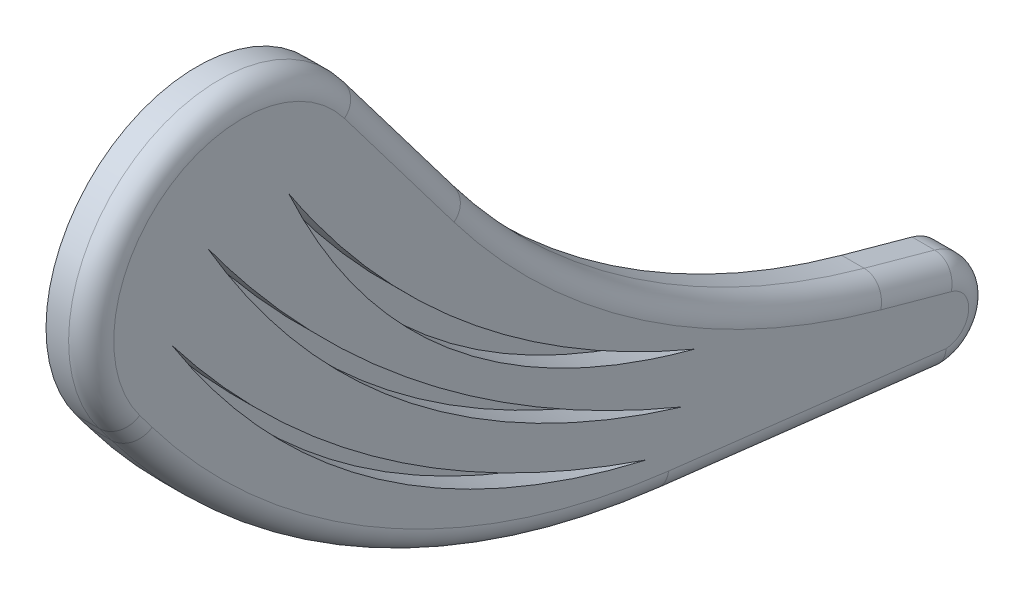
ISO-10303-21;
HEADER;
FILE_DESCRIPTION(('STEP AP214'),'2;1');
FILE_NAME('part.step','',(''),(''),'','','');
FILE_SCHEMA(('AUTOMOTIVE_DESIGN { 1 0 10303 214 1 1 1 1 }'));
ENDSEC;
DATA;
#1=APPLICATION_CONTEXT('core data for automotive mechanical design processes');
#2=APPLICATION_PROTOCOL_DEFINITION('international standard','automotive_design',2000,#1);
#3=PRODUCT_CONTEXT('',#1,'mechanical');
#4=PRODUCT('Part','Part','',(#3));
#5=PRODUCT_RELATED_PRODUCT_CATEGORY('part','',(#4));
#6=PRODUCT_DEFINITION_FORMATION('','',#4);
#7=PRODUCT_DEFINITION_CONTEXT('part definition',#1,'design');
#8=PRODUCT_DEFINITION('design','',#6,#7);
#9=PRODUCT_DEFINITION_SHAPE('','',#8);
#10=(LENGTH_UNIT() NAMED_UNIT(*) SI_UNIT(.MILLI.,.METRE.));
#11=(NAMED_UNIT(*) PLANE_ANGLE_UNIT() SI_UNIT($,.RADIAN.));
#12=(NAMED_UNIT(*) SI_UNIT($,.STERADIAN.) SOLID_ANGLE_UNIT());
#13=UNCERTAINTY_MEASURE_WITH_UNIT(LENGTH_MEASURE(1.E-05),#10,'distance_accuracy_value','');
#14=(GEOMETRIC_REPRESENTATION_CONTEXT(3) GLOBAL_UNCERTAINTY_ASSIGNED_CONTEXT((#13)) GLOBAL_UNIT_ASSIGNED_CONTEXT((#10,
#11,#12)) REPRESENTATION_CONTEXT('',''));
#15=CARTESIAN_POINT('',(0.,0.,0.));
#16=DIRECTION('',(0.,0.,1.));
#17=DIRECTION('',(1.,0.,0.));
#18=AXIS2_PLACEMENT_3D('',#15,#16,#17);
#19=CARTESIAN_POINT('',(4.064,61.3954938084868,-52.6908545838933));
#20=DIRECTION('',(-1.,0.,0.));
#21=DIRECTION('',(0.,0.,1.));
#22=AXIS2_PLACEMENT_3D('',#19,#20,#21);
#23=CYLINDRICAL_SURFACE('',#22,70.2571780129721);
#24=DIRECTION('',(-1.,0.,0.));
#25=VECTOR('',#24,1.);
#26=CARTESIAN_POINT('',(4.064,18.9694256857444,3.31003653393499));
#27=LINE('',#26,#25);
#28=CARTESIAN_POINT('',(2.032,18.9694256857444,3.31003653393499));
#29=VERTEX_POINT('',#28);
#30=CARTESIAN_POINT('',(0.,18.9694256857444,3.31003653393499));
#31=VERTEX_POINT('',#30);
#32=EDGE_CURVE('E419',#29,#31,#27,.T.);
#33=ORIENTED_EDGE('',*,*,#32,.F.);
#34=CARTESIAN_POINT('',(2.032,61.3954938084868,-52.6908545838933));
#35=DIRECTION('',(1.,0.,0.));
#36=DIRECTION('',(0.,0.,-1.));
#37=AXIS2_PLACEMENT_3D('',#34,#35,#36);
#38=CIRCLE('',#37,70.2571780129721);
#39=CARTESIAN_POINT('',(2.032,-6.33047493311499,-34.0022425338234));
#40=VERTEX_POINT('',#39);
#41=EDGE_CURVE('E11',#29,#40,#38,.T.);
#42=ORIENTED_EDGE('',*,*,#41,.T.);
#43=DIRECTION('',(-1.,0.,0.));
#44=VECTOR('',#43,1.);
#45=CARTESIAN_POINT('',(4.064,-6.33047493311499,-34.0022425338234));
#46=LINE('',#45,#44);
#47=CARTESIAN_POINT('',(0.,-6.33047493311499,-34.0022425338234));
#48=VERTEX_POINT('',#47);
#49=EDGE_CURVE('E398',#40,#48,#46,.T.);
#50=ORIENTED_EDGE('',*,*,#49,.T.);
#51=CARTESIAN_POINT('',(0.,61.3954938084868,-52.6908545838933));
#52=DIRECTION('',(1.,0.,0.));
#53=DIRECTION('',(0.,0.,-1.));
#54=AXIS2_PLACEMENT_3D('',#51,#52,#53);
#55=CIRCLE('',#54,70.2571780129721);
#56=EDGE_CURVE('E356',#31,#48,#55,.T.);
#57=ORIENTED_EDGE('',*,*,#56,.F.);
#58=EDGE_LOOP('',(#33,#42,#50,#57));
#59=FACE_BOUND('',#58,.T.);
#60=ADVANCED_FACE('F46',(#59),#23,.F.);
#61=CARTESIAN_POINT('',(4.064,5.32409536328046,-7.02761528307115));
#62=DIRECTION('',(0.,0.603868093234675,-0.797084265290137));
#63=DIRECTION('',(0.,0.797084265290137,0.603868093234675));
#64=AXIS2_PLACEMENT_3D('',#61,#62,#63);
#65=PLANE('',#64);
#66=DIRECTION('',(-1.,0.,0.));
#67=VECTOR('',#66,1.);
#68=CARTESIAN_POINT('',(4.064,31.9923804396434,13.1761789205946));
#69=LINE('',#68,#67);
#70=CARTESIAN_POINT('',(2.032,31.9923804396434,13.1761789205946));
#71=VERTEX_POINT('',#70);
#72=CARTESIAN_POINT('',(0.,31.9923804396434,13.1761789205946));
#73=VERTEX_POINT('',#72);
#74=EDGE_CURVE('E416',#71,#73,#69,.T.);
#75=ORIENTED_EDGE('',*,*,#74,.F.);
#76=DIRECTION('',(0.,-0.797084265290137,-0.603868093234675));
#77=VECTOR('',#76,1.);
#78=CARTESIAN_POINT('',(2.032,5.32409536328046,-7.02761528307115));
#79=LINE('',#78,#77);
#80=EDGE_CURVE('E56',#71,#29,#79,.T.);
#81=ORIENTED_EDGE('',*,*,#80,.T.);
#82=ORIENTED_EDGE('',*,*,#32,.T.);
#83=DIRECTION('',(0.,-0.797084265290137,-0.603868093234675));
#84=VECTOR('',#83,1.);
#85=CARTESIAN_POINT('',(0.,5.32409536328046,-7.02761528307115));
#86=LINE('',#85,#84);
#87=EDGE_CURVE('E363',#73,#31,#86,.T.);
#88=ORIENTED_EDGE('',*,*,#87,.F.);
#89=EDGE_LOOP('',(#75,#81,#82,#88));
#90=FACE_BOUND('',#89,.T.);
#91=ADVANCED_FACE('F303',(#90),#65,.T.);
#92=CARTESIAN_POINT('',(4.064,23.7918650694692,24.0005656402545));
#93=DIRECTION('',(-1.,0.,0.));
#94=DIRECTION('',(0.,0.,1.));
#95=AXIS2_PLACEMENT_3D('',#92,#93,#94);
#96=CYLINDRICAL_SURFACE('',#95,13.5799779157852);
#97=DIRECTION('',(-1.,0.,0.));
#98=VECTOR('',#97,1.);
#99=CARTESIAN_POINT('',(4.064,15.6105357122038,34.8394608856731));
#100=LINE('',#99,#98);
#101=CARTESIAN_POINT('',(2.032,15.6105357122038,34.8394608856731));
#102=VERTEX_POINT('',#101);
#103=CARTESIAN_POINT('',(0.,15.6105357122038,34.8394608856731));
#104=VERTEX_POINT('',#103);
#105=EDGE_CURVE('E413',#102,#104,#100,.T.);
#106=ORIENTED_EDGE('',*,*,#105,.F.);
#107=CARTESIAN_POINT('',(2.032,23.7918650694692,24.0005656402545));
#108=DIRECTION('',(1.,0.,0.));
#109=DIRECTION('',(0.,0.,-1.));
#110=AXIS2_PLACEMENT_3D('',#107,#108,#109);
#111=CIRCLE('',#110,13.5799779157852);
#112=EDGE_CURVE('E463',#102,#71,#111,.F.);
#113=ORIENTED_EDGE('',*,*,#112,.T.);
#114=ORIENTED_EDGE('',*,*,#74,.T.);
#115=CARTESIAN_POINT('',(0.,23.7918650694692,24.0005656402545));
#116=DIRECTION('',(1.,0.,0.));
#117=DIRECTION('',(0.,0.,-1.));
#118=AXIS2_PLACEMENT_3D('',#115,#116,#117);
#119=CIRCLE('',#118,13.5799779157852);
#120=EDGE_CURVE('E370',#73,#104,#119,.T.);
#121=ORIENTED_EDGE('',*,*,#120,.T.);
#122=EDGE_LOOP('',(#106,#113,#114,#121));
#123=FACE_BOUND('',#122,.T.);
#124=ADVANCED_FACE('F299',(#123),#96,.T.);
#125=CARTESIAN_POINT('',(4.064,-11.0867182492119,14.6880503731332));
#126=DIRECTION('',(0.,0.602455277026211,-0.798152641531224));
#127=DIRECTION('',(0.,0.798152641531224,0.602455277026211));
#128=AXIS2_PLACEMENT_3D('',#125,#126,#127);
#129=PLANE('',#128);
#130=DIRECTION('',(-1.,0.,0.));
#131=VECTOR('',#130,1.);
#132=CARTESIAN_POINT('',(4.064,14.1277592112356,33.7202432308334));
#133=LINE('',#132,#131);
#134=CARTESIAN_POINT('',(2.032,14.1277592112356,33.7202432308334));
#135=VERTEX_POINT('',#134);
#136=CARTESIAN_POINT('',(0.,14.1277592112356,33.7202432308334));
#137=VERTEX_POINT('',#136);
#138=EDGE_CURVE('E410',#135,#137,#133,.T.);
#139=ORIENTED_EDGE('',*,*,#138,.F.);
#140=DIRECTION('',(0.,-0.798152641531224,-0.602455277026211));
#141=VECTOR('',#140,1.);
#142=CARTESIAN_POINT('',(2.032,15.6105357122038,34.8394608856732));
#143=LINE('',#142,#141);
#144=EDGE_CURVE('E460',#135,#102,#143,.F.);
#145=ORIENTED_EDGE('',*,*,#144,.T.);
#146=ORIENTED_EDGE('',*,*,#105,.T.);
#147=DIRECTION('',(0.,-0.798152641531224,-0.602455277026211));
#148=VECTOR('',#147,1.);
#149=CARTESIAN_POINT('',(0.,-11.0867182492119,14.6880503731332));
#150=LINE('',#149,#148);
#151=EDGE_CURVE('E379',#104,#137,#150,.T.);
#152=ORIENTED_EDGE('',*,*,#151,.T.);
#153=EDGE_LOOP('',(#139,#145,#146,#152));
#154=FACE_BOUND('',#153,.T.);
#155=ADVANCED_FACE('F295',(#154),#129,.F.);
#156=CARTESIAN_POINT('',(4.064,56.4545668541204,-22.3557089867498));
#157=DIRECTION('',(-1.,0.,0.));
#158=DIRECTION('',(0.,0.,1.));
#159=AXIS2_PLACEMENT_3D('',#156,#157,#158);
#160=CYLINDRICAL_SURFACE('',#159,70.2571780129719);
#161=DIRECTION('',(-1.,0.,0.));
#162=VECTOR('',#161,1.);
#163=CARTESIAN_POINT('',(4.064,-13.3195793217241,-14.1313799698464));
#164=LINE('',#163,#162);
#165=CARTESIAN_POINT('',(2.032,-13.3195793217241,-14.1313799698464));
#166=VERTEX_POINT('',#165);
#167=CARTESIAN_POINT('',(0.,-13.3195793217241,-14.1313799698464));
#168=VERTEX_POINT('',#167);
#169=EDGE_CURVE('E407',#166,#168,#164,.T.);
#170=ORIENTED_EDGE('',*,*,#169,.F.);
#171=CARTESIAN_POINT('',(2.032,56.4545668541204,-22.3557089867498));
#172=DIRECTION('',(1.,0.,0.));
#173=DIRECTION('',(0.,0.,-1.));
#174=AXIS2_PLACEMENT_3D('',#171,#172,#173);
#175=CIRCLE('',#174,70.2571780129719);
#176=EDGE_CURVE('E457',#166,#135,#175,.F.);
#177=ORIENTED_EDGE('',*,*,#176,.T.);
#178=ORIENTED_EDGE('',*,*,#138,.T.);
#179=CARTESIAN_POINT('',(0.,56.4545668541204,-22.3557089867498));
#180=DIRECTION('',(1.,0.,0.));
#181=DIRECTION('',(0.,0.,-1.));
#182=AXIS2_PLACEMENT_3D('',#179,#180,#181);
#183=CIRCLE('',#182,70.2571780129719);
#184=EDGE_CURVE('E383',#168,#137,#183,.F.);
#185=ORIENTED_EDGE('',*,*,#184,.F.);
#186=EDGE_LOOP('',(#170,#177,#178,#185));
#187=FACE_BOUND('',#186,.T.);
#188=ADVANCED_FACE('F291',(#187),#160,.T.);
#189=CARTESIAN_POINT('',(4.064,-11.4942084872456,1.35483065818888));
#190=DIRECTION('',(0.,0.993124804457162,-0.117060338167646));
#191=DIRECTION('',(0.,0.117060338167646,0.993124804457162));
#192=AXIS2_PLACEMENT_3D('',#189,#190,#191);
#193=PLANE('',#192);
#194=DIRECTION('',(-1.,0.,0.));
#195=VECTOR('',#194,1.);
#196=CARTESIAN_POINT('',(4.064,-16.2786445212172,-39.2357073075474));
#197=LINE('',#196,#195);
#198=CARTESIAN_POINT('',(2.032,-16.2786445212172,-39.2357073075474));
#199=VERTEX_POINT('',#198);
#200=CARTESIAN_POINT('',(0.,-16.2786445212172,-39.2357073075474));
#201=VERTEX_POINT('',#200);
#202=EDGE_CURVE('E404',#199,#201,#197,.T.);
#203=ORIENTED_EDGE('',*,*,#202,.F.);
#204=DIRECTION('',(0.,-0.117060338167646,-0.993124804457162));
#205=VECTOR('',#204,1.);
#206=CARTESIAN_POINT('',(2.032,-13.3195793217241,-14.1313799698464));
#207=LINE('',#206,#205);
#208=EDGE_CURVE('E454',#199,#166,#207,.F.);
#209=ORIENTED_EDGE('',*,*,#208,.T.);
#210=ORIENTED_EDGE('',*,*,#169,.T.);
#211=DIRECTION('',(0.,-0.117060338167646,-0.993124804457162));
#212=VECTOR('',#211,1.);
#213=CARTESIAN_POINT('',(0.,-11.4942084872456,1.35483065818888));
#214=LINE('',#213,#212);
#215=EDGE_CURVE('E387',#168,#201,#214,.T.);
#216=ORIENTED_EDGE('',*,*,#215,.T.);
#217=EDGE_LOOP('',(#203,#209,#210,#216));
#218=FACE_BOUND('',#217,.T.);
#219=ADVANCED_FACE('F287',(#218),#193,.F.);
#220=CARTESIAN_POINT('',(4.064,-12.1046331055293,-39.2357073075474));
#221=DIRECTION('',(-1.,0.,0.));
#222=DIRECTION('',(0.,0.,1.));
#223=AXIS2_PLACEMENT_3D('',#220,#221,#222);
#224=CYLINDRICAL_SURFACE('',#223,4.17401141568788);
#225=DIRECTION('',(-1.,0.,0.));
#226=VECTOR('',#225,1.);
#227=CARTESIAN_POINT('',(4.064,-8.08100200247289,-40.346006386539));
#228=LINE('',#227,#226);
#229=CARTESIAN_POINT('',(2.032,-8.08100200247289,-40.346006386539));
#230=VERTEX_POINT('',#229);
#231=CARTESIAN_POINT('',(0.,-8.08100200247289,-40.346006386539));
#232=VERTEX_POINT('',#231);
#233=EDGE_CURVE('E401',#230,#232,#228,.T.);
#234=ORIENTED_EDGE('',*,*,#233,.F.);
#235=CARTESIAN_POINT('',(2.032,-12.1046331055293,-39.2357073075474));
#236=DIRECTION('',(1.,0.,0.));
#237=DIRECTION('',(0.,0.,-1.));
#238=AXIS2_PLACEMENT_3D('',#235,#236,#237);
#239=CIRCLE('',#238,4.17401141568788);
#240=EDGE_CURVE('E451',#230,#199,#239,.F.);
#241=ORIENTED_EDGE('',*,*,#240,.T.);
#242=ORIENTED_EDGE('',*,*,#202,.T.);
#243=CARTESIAN_POINT('',(0.,-12.1046331055293,-39.2357073075474));
#244=DIRECTION('',(1.,0.,0.));
#245=DIRECTION('',(0.,0.,-1.));
#246=AXIS2_PLACEMENT_3D('',#243,#244,#245);
#247=CIRCLE('',#246,4.17401141568788);
#248=EDGE_CURVE('E391',#201,#232,#247,.T.);
#249=ORIENTED_EDGE('',*,*,#248,.T.);
#250=EDGE_LOOP('',(#234,#241,#242,#249));
#251=FACE_BOUND('',#250,.T.);
#252=ADVANCED_FACE('F283',(#251),#224,.T.);
#253=CARTESIAN_POINT('',(4.064,2.83628832722713,-0.78265830957587));
#254=DIRECTION('',(0.,0.963972232546787,-0.266002885094809));
#255=DIRECTION('',(0.,0.266002885094809,0.963972232546788));
#256=AXIS2_PLACEMENT_3D('',#253,#254,#255);
#257=PLANE('',#256);
#258=ORIENTED_EDGE('',*,*,#49,.F.);
#259=DIRECTION('',(0.,-0.266002885094809,-0.963972232546788));
#260=VECTOR('',#259,1.);
#261=CARTESIAN_POINT('',(2.032,2.83628832722713,-0.78265830957587));
#262=LINE('',#261,#260);
#263=EDGE_CURVE('E422',#40,#230,#262,.T.);
#264=ORIENTED_EDGE('',*,*,#263,.T.);
#265=ORIENTED_EDGE('',*,*,#233,.T.);
#266=DIRECTION('',(0.,-0.266002885094809,-0.963972232546788));
#267=VECTOR('',#266,1.);
#268=CARTESIAN_POINT('',(0.,2.83628832722713,-0.78265830957587));
#269=LINE('',#268,#267);
#270=EDGE_CURVE('E395',#48,#232,#269,.T.);
#271=ORIENTED_EDGE('',*,*,#270,.F.);
#272=EDGE_LOOP('',(#258,#264,#265,#271));
#273=FACE_BOUND('',#272,.T.);
#274=ADVANCED_FACE('F276',(#273),#257,.T.);
#275=CARTESIAN_POINT('',(4.064,0.,0.));
#276=DIRECTION('',(1.,0.,0.));
#277=DIRECTION('',(0.,0.,-1.));
#278=AXIS2_PLACEMENT_3D('',#275,#276,#277);
#279=PLANE('',#278);
#280=CARTESIAN_POINT('',(4.064,-6.92361124881392,-15.6168205250554));
#281=CARTESIAN_POINT('',(4.064,3.87540107117476,10.4296008555567));
#282=CARTESIAN_POINT('',(4.064,26.808808681812,27.1165194369345));
#283=B_SPLINE_CURVE_WITH_KNOTS('',2,(#280,#281,#282),.UNSPECIFIED.,.F.,.F.,(3,3),(0.,1.),.UNSPECIFIED.);
#284=CARTESIAN_POINT('',(4.064,-6.92361124881392,-15.6168205250554));
#285=VERTEX_POINT('',#284);
#286=CARTESIAN_POINT('',(4.064,26.808808681812,27.1165194369345));
#287=VERTEX_POINT('',#286);
#288=EDGE_CURVE('E64',#285,#287,#283,.T.);
#289=ORIENTED_EDGE('',*,*,#288,.F.);
#290=CARTESIAN_POINT('',(4.064,26.808808681812,27.1165194369345));
#291=CARTESIAN_POINT('',(4.064,1.59519261586339,12.366986247784));
#292=CARTESIAN_POINT('',(4.064,-6.92361124881392,-15.6168205250554));
#293=B_SPLINE_CURVE_WITH_KNOTS('',2,(#290,#291,#292),.UNSPECIFIED.,.F.,.F.,(3,3),(0.,1.),.UNSPECIFIED.);
#294=EDGE_CURVE('E239',#287,#285,#293,.T.);
#295=ORIENTED_EDGE('',*,*,#294,.F.);
#296=EDGE_LOOP('',(#289,#295));
#297=FACE_BOUND('',#296,.T.);
#298=CARTESIAN_POINT('',(4.064,27.3976539175087,19.7980143647039));
#299=CARTESIAN_POINT('',(4.064,3.87492946570004,8.98445813811228));
#300=CARTESIAN_POINT('',(4.064,-2.96993609485029,-16.7103902484922));
#301=B_SPLINE_CURVE_WITH_KNOTS('',2,(#298,#299,#300),.UNSPECIFIED.,.F.,.F.,(3,3),(0.,1.),.UNSPECIFIED.);
#302=CARTESIAN_POINT('',(4.064,27.3976539175087,19.7980143647039));
#303=VERTEX_POINT('',#302);
#304=CARTESIAN_POINT('',(4.064,-2.96993609485029,-16.7103902484922));
#305=VERTEX_POINT('',#304);
#306=EDGE_CURVE('E72',#303,#305,#301,.T.);
#307=ORIENTED_EDGE('',*,*,#306,.F.);
#308=CARTESIAN_POINT('',(4.064,-2.96993609485029,-16.7103902484922));
#309=CARTESIAN_POINT('',(4.064,6.66431164897271,6.19544167854816));
#310=CARTESIAN_POINT('',(4.064,27.3976539175087,19.7980143647039));
#311=B_SPLINE_CURVE_WITH_KNOTS('',2,(#308,#309,#310),.UNSPECIFIED.,.F.,.F.,(3,3),(0.,1.),.UNSPECIFIED.);
#312=EDGE_CURVE('E183',#305,#303,#311,.T.);
#313=ORIENTED_EDGE('',*,*,#312,.F.);
#314=EDGE_LOOP('',(#307,#313));
#315=FACE_BOUND('',#314,.T.);
#316=CARTESIAN_POINT('',(4.064,-9.44723368751411,-12.4202321027019));
#317=CARTESIAN_POINT('',(4.064,-0.495600494692885,13.9411575609503));
#318=CARTESIAN_POINT('',(4.064,20.8362355768882,30.313107859288));
#319=B_SPLINE_CURVE_WITH_KNOTS('',2,(#316,#317,#318),.UNSPECIFIED.,.F.,.F.,(3,3),(0.,1.),.UNSPECIFIED.);
#320=CARTESIAN_POINT('',(4.064,-9.44723368751411,-12.4202321027019));
#321=VERTEX_POINT('',#320);
#322=CARTESIAN_POINT('',(4.064,20.8362355768882,30.313107859288));
#323=VERTEX_POINT('',#322);
#324=EDGE_CURVE('E484',#321,#323,#319,.T.);
#325=ORIENTED_EDGE('',*,*,#324,.F.);
#326=CARTESIAN_POINT('',(4.064,20.8362355768882,30.313107859288));
#327=CARTESIAN_POINT('',(4.064,-3.07472840093882,15.0725793982242));
#328=CARTESIAN_POINT('',(4.064,-9.44723368751411,-12.4202321027019));
#329=B_SPLINE_CURVE_WITH_KNOTS('',2,(#326,#327,#328),.UNSPECIFIED.,.F.,.F.,(3,3),(0.,1.),.UNSPECIFIED.);
#330=EDGE_CURVE('E256',#323,#321,#329,.T.);
#331=ORIENTED_EDGE('',*,*,#330,.F.);
#332=EDGE_LOOP('',(#325,#331));
#333=FACE_BOUND('',#332,.T.);
#334=CARTESIAN_POINT('',(4.064,-12.1046331055293,-39.2357073075474));
#335=DIRECTION('',(1.,0.,0.));
#336=DIRECTION('',(0.,0.,-1.));
#337=AXIS2_PLACEMENT_3D('',#334,#335,#336);
#338=CIRCLE('',#337,2.14201141568788);
#339=CARTESIAN_POINT('',(4.064,-14.2443247289105,-39.3353700476752));
#340=VERTEX_POINT('',#339);
#341=CARTESIAN_POINT('',(4.064,-10.039793579008,-39.8054885240264));
#342=VERTEX_POINT('',#341);
#343=EDGE_CURVE('E444',#340,#342,#338,.T.);
#344=ORIENTED_EDGE('',*,*,#343,.T.);
#345=DIRECTION('',(0.,-0.266002885094809,-0.963972232546788));
#346=VECTOR('',#345,1.);
#347=CARTESIAN_POINT('',(4.064,0.877496750692055,-0.242140447063218));
#348=LINE('',#347,#346);
#349=CARTESIAN_POINT('',(4.064,-8.28926650965007,-33.4617246713108));
#350=VERTEX_POINT('',#349);
#351=EDGE_CURVE('E447',#342,#350,#348,.F.);
#352=ORIENTED_EDGE('',*,*,#351,.T.);
#353=CARTESIAN_POINT('',(4.064,61.3954938084868,-52.6908545838933));
#354=DIRECTION('',(1.,0.,0.));
#355=DIRECTION('',(0.,0.,-1.));
#356=AXIS2_PLACEMENT_3D('',#353,#354,#355);
#357=CIRCLE('',#356,72.2891780129721);
#358=CARTESIAN_POINT('',(4.064,17.7423657202915,4.92971176100454));
#359=VERTEX_POINT('',#358);
#360=EDGE_CURVE('E426',#350,#359,#357,.F.);
#361=ORIENTED_EDGE('',*,*,#360,.T.);
#362=DIRECTION('',(0.,-0.797084265290137,-0.603868093234675));
#363=VECTOR('',#362,1.);
#364=CARTESIAN_POINT('',(4.064,4.0970353978276,-5.40794005600159));
#365=LINE('',#364,#363);
#366=CARTESIAN_POINT('',(4.064,30.7653204741906,14.7958541476642));
#367=VERTEX_POINT('',#366);
#368=EDGE_CURVE('E429',#359,#367,#365,.F.);
#369=ORIENTED_EDGE('',*,*,#368,.T.);
#370=CARTESIAN_POINT('',(4.064,23.7918650694692,24.0005656402545));
#371=DIRECTION('',(1.,0.,0.));
#372=DIRECTION('',(0.,0.,-1.));
#373=AXIS2_PLACEMENT_3D('',#370,#371,#372);
#374=CIRCLE('',#373,11.5479779157852);
#375=CARTESIAN_POINT('',(4.064,16.834724835121,33.2176147180817));
#376=VERTEX_POINT('',#375);
#377=EDGE_CURVE('E432',#367,#376,#374,.T.);
#378=ORIENTED_EDGE('',*,*,#377,.T.);
#379=DIRECTION('',(0.,-0.798152641531224,-0.602455277026211));
#380=VECTOR('',#379,1.);
#381=CARTESIAN_POINT('',(4.064,15.3519483341529,32.098397063242));
#382=LINE('',#381,#380);
#383=CARTESIAN_POINT('',(4.064,15.3519483341529,32.0983970632419));
#384=VERTEX_POINT('',#383);
#385=EDGE_CURVE('E435',#376,#384,#382,.T.);
#386=ORIENTED_EDGE('',*,*,#385,.T.);
#387=CARTESIAN_POINT('',(4.064,56.4545668541204,-22.3557089867498));
#388=DIRECTION('',(1.,0.,0.));
#389=DIRECTION('',(0.,0.,-1.));
#390=AXIS2_PLACEMENT_3D('',#387,#388,#389);
#391=CIRCLE('',#390,68.2251780129719);
#392=CARTESIAN_POINT('',(4.064,-11.3015497190673,-14.3692465770031));
#393=VERTEX_POINT('',#392);
#394=EDGE_CURVE('E438',#384,#393,#391,.T.);
#395=ORIENTED_EDGE('',*,*,#394,.T.);
#396=DIRECTION('',(0.,-0.117060338167646,-0.993124804457162));
#397=VECTOR('',#396,1.);
#398=CARTESIAN_POINT('',(4.064,-14.2606149185602,-39.4735739147041));
#399=LINE('',#398,#397);
#400=EDGE_CURVE('E441',#393,#340,#399,.T.);
#401=ORIENTED_EDGE('',*,*,#400,.T.);
#402=EDGE_LOOP('',(#344,#352,#361,#369,#378,#386,#395,#401));
#403=FACE_BOUND('',#402,.T.);
#404=ADVANCED_FACE('F188',(#297,#315,#333,#403),#279,.T.);
#405=CARTESIAN_POINT('',(0.,0.,0.));
#406=DIRECTION('',(1.,0.,0.));
#407=DIRECTION('',(0.,0.,-1.));
#408=AXIS2_PLACEMENT_3D('',#405,#406,#407);
#409=PLANE('',#408);
#410=ORIENTED_EDGE('',*,*,#56,.T.);
#411=ORIENTED_EDGE('',*,*,#270,.T.);
#412=ORIENTED_EDGE('',*,*,#248,.F.);
#413=ORIENTED_EDGE('',*,*,#215,.F.);
#414=ORIENTED_EDGE('',*,*,#184,.T.);
#415=ORIENTED_EDGE('',*,*,#151,.F.);
#416=ORIENTED_EDGE('',*,*,#120,.F.);
#417=ORIENTED_EDGE('',*,*,#87,.T.);
#418=EDGE_LOOP('',(#410,#411,#412,#413,#414,#415,#416,#417));
#419=FACE_BOUND('',#418,.T.);
#420=ADVANCED_FACE('F275',(#419),#409,.F.);
#421=CARTESIAN_POINT('',(2.032,-9.86252912629467,13.0662042055418));
#422=DIRECTION('',(0.,0.798152641531224,0.602455277026211));
#423=DIRECTION('',(0.,-0.602455277026211,0.798152641531224));
#424=AXIS2_PLACEMENT_3D('',#421,#422,#423);
#425=CYLINDRICAL_SURFACE('',#424,2.032);
#426=CARTESIAN_POINT('',(2.032,15.3519483341529,32.0983970632419));
#427=DIRECTION('',(0.,-0.798152641531225,-0.60245527702621));
#428=DIRECTION('',(0.,0.60245527702621,-0.798152641531225));
#429=AXIS2_PLACEMENT_3D('',#426,#427,#428);
#430=CIRCLE('',#429,2.032);
#431=EDGE_CURVE('E347',#384,#135,#430,.T.);
#432=ORIENTED_EDGE('',*,*,#431,.F.);
#433=ORIENTED_EDGE('',*,*,#385,.F.);
#434=CARTESIAN_POINT('',(2.032,16.834724835121,33.2176147180817));
#435=DIRECTION('',(0.,0.798152641531224,0.602455277026212));
#436=DIRECTION('',(0.,-0.602455277026212,0.798152641531224));
#437=AXIS2_PLACEMENT_3D('',#434,#435,#436);
#438=CIRCLE('',#437,2.032);
#439=EDGE_CURVE('E50',#102,#376,#438,.T.);
#440=ORIENTED_EDGE('',*,*,#439,.F.);
#441=ORIENTED_EDGE('',*,*,#144,.F.);
#442=EDGE_LOOP('',(#432,#433,#440,#441));
#443=FACE_BOUND('',#442,.T.);
#444=ADVANCED_FACE('F48',(#443),#425,.T.);
#445=CARTESIAN_POINT('',(2.032,23.7918650694692,24.0005656402545));
#446=DIRECTION('',(1.,0.,0.));
#447=DIRECTION('',(0.,0.,-1.));
#448=AXIS2_PLACEMENT_3D('',#445,#446,#447);
#449=TOROIDAL_SURFACE('',#448,11.5479779157852,2.032);
#450=ORIENTED_EDGE('',*,*,#439,.T.);
#451=ORIENTED_EDGE('',*,*,#377,.F.);
#452=CARTESIAN_POINT('',(2.032,30.7653204741906,14.7958541476642));
#453=DIRECTION('',(0.,-0.797084265290135,-0.603868093234677));
#454=DIRECTION('',(0.,0.603868093234677,-0.797084265290135));
#455=AXIS2_PLACEMENT_3D('',#452,#453,#454);
#456=CIRCLE('',#455,2.032);
#457=EDGE_CURVE('E344',#71,#367,#456,.T.);
#458=ORIENTED_EDGE('',*,*,#457,.F.);
#459=ORIENTED_EDGE('',*,*,#112,.F.);
#460=EDGE_LOOP('',(#450,#451,#458,#459));
#461=FACE_BOUND('',#460,.T.);
#462=ADVANCED_FACE('F565',(#461),#449,.T.);
#463=CARTESIAN_POINT('',(2.032,56.4545668541204,-22.3557089867498));
#464=DIRECTION('',(1.,0.,0.));
#465=DIRECTION('',(0.,0.,-1.));
#466=AXIS2_PLACEMENT_3D('',#463,#464,#465);
#467=TOROIDAL_SURFACE('',#466,68.2251780129719,2.032);
#468=ORIENTED_EDGE('',*,*,#431,.T.);
#469=ORIENTED_EDGE('',*,*,#176,.F.);
#470=CARTESIAN_POINT('',(2.032,-11.3015497190673,-14.3692465770031));
#471=DIRECTION('',(0.,-0.117060338167646,-0.993124804457162));
#472=DIRECTION('',(0.,0.993124804457162,-0.117060338167646));
#473=AXIS2_PLACEMENT_3D('',#470,#471,#472);
#474=CIRCLE('',#473,2.032);
#475=EDGE_CURVE('E340',#393,#166,#474,.T.);
#476=ORIENTED_EDGE('',*,*,#475,.F.);
#477=ORIENTED_EDGE('',*,*,#394,.F.);
#478=EDGE_LOOP('',(#468,#469,#476,#477));
#479=FACE_BOUND('',#478,.T.);
#480=ADVANCED_FACE('F569',(#479),#467,.T.);
#481=CARTESIAN_POINT('',(2.032,4.0970353978276,-5.40794005600159));
#482=DIRECTION('',(0.,-0.797084265290137,-0.603868093234675));
#483=DIRECTION('',(0.,0.603868093234675,-0.797084265290137));
#484=AXIS2_PLACEMENT_3D('',#481,#482,#483);
#485=CYLINDRICAL_SURFACE('',#484,2.032);
#486=ORIENTED_EDGE('',*,*,#457,.T.);
#487=ORIENTED_EDGE('',*,*,#368,.F.);
#488=CARTESIAN_POINT('',(2.032,17.7423657202915,4.92971176100455));
#489=DIRECTION('',(0.,-0.797084265290137,-0.603868093234675));
#490=DIRECTION('',(0.,0.603868093234675,-0.797084265290137));
#491=AXIS2_PLACEMENT_3D('',#488,#489,#490);
#492=CIRCLE('',#491,2.032);
#493=EDGE_CURVE('E334',#29,#359,#492,.T.);
#494=ORIENTED_EDGE('',*,*,#493,.F.);
#495=ORIENTED_EDGE('',*,*,#80,.F.);
#496=EDGE_LOOP('',(#486,#487,#494,#495));
#497=FACE_BOUND('',#496,.T.);
#498=ADVANCED_FACE('F320',(#497),#485,.T.);
#499=CARTESIAN_POINT('',(2.032,-9.47617888458869,1.11696405103223));
#500=DIRECTION('',(0.,0.117060338167646,0.993124804457162));
#501=DIRECTION('',(0.,-0.993124804457162,0.117060338167646));
#502=AXIS2_PLACEMENT_3D('',#499,#500,#501);
#503=CYLINDRICAL_SURFACE('',#502,2.032);
#504=ORIENTED_EDGE('',*,*,#475,.T.);
#505=ORIENTED_EDGE('',*,*,#208,.F.);
#506=CARTESIAN_POINT('',(2.032,-16.2786445212172,-39.2357073075474));
#507=CARTESIAN_POINT('',(2.08909086477576,-16.2786441679613,-39.2357071301812));
#508=CARTESIAN_POINT('',(2.14615435802799,-16.2762369801685,-39.2358487301557));
#509=CARTESIAN_POINT('',(2.25987260834942,-16.2666339179411,-39.2364123251686));
#510=CARTESIAN_POINT('',(2.31652738591422,-16.2594382853407,-39.2368343060466));
#511=CARTESIAN_POINT('',(2.48517360158773,-16.2307369301694,-39.2385142820201));
#512=CARTESIAN_POINT('',(2.59603461393692,-16.2021165624859,-39.2401863318162));
#513=CARTESIAN_POINT('',(2.81136493946595,-16.126702402133,-39.244553398101));
#514=CARTESIAN_POINT('',(2.91583127055291,-16.0799002041785,-39.247248887703));
#515=CARTESIAN_POINT('',(3.11540925704555,-15.9694638762637,-39.2535275307053));
#516=CARTESIAN_POINT('',(3.21052298054895,-15.9058334789771,-39.2571104872448));
#517=CARTESIAN_POINT('',(3.38876817069997,-15.7635067678171,-39.2649845993989));
#518=CARTESIAN_POINT('',(3.47189261140737,-15.6848016822782,-39.2692761671388));
#519=CARTESIAN_POINT('',(3.62378190293188,-15.5145541278173,-39.2783442101934));
#520=CARTESIAN_POINT('',(3.69254218598409,-15.4230075907686,-39.2831208390408));
#521=CARTESIAN_POINT('',(3.81385153787197,-15.2295297924234,-39.2929091332432));
#522=CARTESIAN_POINT('',(3.86637068258056,-15.1275798169764,-39.2979212130798));
#523=CARTESIAN_POINT('',(3.95353327565749,-14.9163476607062,-39.3078877802877));
#524=CARTESIAN_POINT('',(3.98819062340749,-14.8070712561002,-39.3128423094989));
#525=CARTESIAN_POINT('',(4.02952475155169,-14.6249427675017,-39.3206540296102));
#526=CARTESIAN_POINT('',(4.04179431938676,-14.5533081107696,-39.3236182945804));
#527=CARTESIAN_POINT('',(4.05862277099298,-14.4092030069076,-39.329324499834));
#528=CARTESIAN_POINT('',(4.06319413496736,-14.3367341046935,-39.3320667930889));
#529=CARTESIAN_POINT('',(4.06396760399971,-14.2576256415239,-39.33489783133));
#530=CARTESIAN_POINT('',(4.06400008522782,-14.2509749499781,-39.3351345840586));
#531=CARTESIAN_POINT('',(4.064,-14.2443247289104,-39.335370047675));
#532=B_SPLINE_CURVE_WITH_KNOTS('',3,(#506,#507,#508,#509,#510,#511,#512,#513,#514,#515,#516,
#517,#518,#519,#520,#521,#522,#523,#524,#525,#526,#527,#528,#529,#530,#531),.UNSPECIFIED.,.F.,
.F.,(4,2,2,2,2,2,2,2,2,2,2,2,4),(0.,0.171167327728765,0.34232601153386,0.684087476598604,
1.02600712307114,1.36785099164416,1.7098943800982,2.052046372446,2.39482507101977,
2.73733662776694,2.95519626989931,3.17270238028774,3.19266695379809),.UNSPECIFIED.);
#533=EDGE_CURVE('E325',#340,#199,#532,.F.);
#534=ORIENTED_EDGE('',*,*,#533,.F.);
#535=ORIENTED_EDGE('',*,*,#400,.F.);
#536=EDGE_LOOP('',(#504,#505,#534,#535));
#537=FACE_BOUND('',#536,.T.);
#538=ADVANCED_FACE('F315',(#537),#503,.T.);
#539=CARTESIAN_POINT('',(2.032,61.3954938084868,-52.6908545838933));
#540=DIRECTION('',(1.,0.,0.));
#541=DIRECTION('',(0.,0.,-1.));
#542=AXIS2_PLACEMENT_3D('',#539,#540,#541);
#543=TOROIDAL_SURFACE('',#542,72.2891780129721,2.032);
#544=ORIENTED_EDGE('',*,*,#493,.T.);
#545=ORIENTED_EDGE('',*,*,#360,.F.);
#546=CARTESIAN_POINT('',(2.032,-8.28926650965007,-33.4617246713108));
#547=DIRECTION('',(0.,-0.266002885094806,-0.963972232546788));
#548=DIRECTION('',(0.,0.963972232546788,-0.266002885094806));
#549=AXIS2_PLACEMENT_3D('',#546,#547,#548);
#550=CIRCLE('',#549,2.032);
#551=EDGE_CURVE('E335',#40,#350,#550,.T.);
#552=ORIENTED_EDGE('',*,*,#551,.F.);
#553=ORIENTED_EDGE('',*,*,#41,.F.);
#554=EDGE_LOOP('',(#544,#545,#552,#553));
#555=FACE_BOUND('',#554,.T.);
#556=ADVANCED_FACE('F319',(#555),#543,.T.);
#557=CARTESIAN_POINT('',(2.032,-12.1046331055293,-39.2357073075474));
#558=DIRECTION('',(1.,0.,0.));
#559=DIRECTION('',(0.,0.,-1.));
#560=AXIS2_PLACEMENT_3D('',#557,#558,#559);
#561=TOROIDAL_SURFACE('',#560,2.14201141568788,2.032);
#562=ORIENTED_EDGE('',*,*,#533,.T.);
#563=ORIENTED_EDGE('',*,*,#240,.F.);
#564=CARTESIAN_POINT('',(2.032,-10.039793579008,-39.8054885240264));
#565=DIRECTION('',(0.,0.266002885094809,0.963972232546788));
#566=DIRECTION('',(0.,-0.963972232546788,0.266002885094809));
#567=AXIS2_PLACEMENT_3D('',#564,#565,#566);
#568=CIRCLE('',#567,2.032);
#569=EDGE_CURVE('E467',#342,#230,#568,.T.);
#570=ORIENTED_EDGE('',*,*,#569,.F.);
#571=ORIENTED_EDGE('',*,*,#343,.F.);
#572=EDGE_LOOP('',(#562,#563,#570,#571));
#573=FACE_BOUND('',#572,.T.);
#574=ADVANCED_FACE('F313',(#573),#561,.T.);
#575=CARTESIAN_POINT('',(2.032,0.877496750692056,-0.242140447063218));
#576=DIRECTION('',(0.,-0.266002885094809,-0.963972232546788));
#577=DIRECTION('',(0.,0.963972232546787,-0.266002885094809));
#578=AXIS2_PLACEMENT_3D('',#575,#576,#577);
#579=CYLINDRICAL_SURFACE('',#578,2.032);
#580=ORIENTED_EDGE('',*,*,#551,.T.);
#581=ORIENTED_EDGE('',*,*,#351,.F.);
#582=ORIENTED_EDGE('',*,*,#569,.T.);
#583=ORIENTED_EDGE('',*,*,#263,.F.);
#584=EDGE_LOOP('',(#580,#581,#582,#583));
#585=FACE_BOUND('',#584,.T.);
#586=ADVANCED_FACE('F270',(#585),#579,.T.);
#587=CARTESIAN_POINT('',(2.032,-9.44723368751411,-12.4202321027019));
#588=CARTESIAN_POINT('',(2.032,-0.495600494692885,13.9411575609503));
#589=CARTESIAN_POINT('',(2.032,20.8362355768882,30.313107859288));
#590=B_SPLINE_CURVE_WITH_KNOTS('',2,(#587,#588,#589),.UNSPECIFIED.,.F.,.F.,(3,3),(0.,1.),.UNSPECIFIED.);
#591=DIRECTION('',(1.,0.,0.));
#592=VECTOR('',#591,1.);
#593=SURFACE_OF_LINEAR_EXTRUSION('',#590,#592);
#594=ORIENTED_EDGE('',*,*,#324,.T.);
#595=DIRECTION('',(1.,0.,0.));
#596=VECTOR('',#595,1.);
#597=CARTESIAN_POINT('',(2.032,20.8362355768882,30.313107859288));
#598=LINE('',#597,#596);
#599=CARTESIAN_POINT('',(2.032,20.8362355768882,30.313107859288));
#600=VERTEX_POINT('',#599);
#601=EDGE_CURVE('E373',#600,#323,#598,.T.);
#602=ORIENTED_EDGE('',*,*,#601,.F.);
#603=CARTESIAN_POINT('',(2.032,-9.44723368751411,-12.4202321027019));
#604=VERTEX_POINT('',#603);
#605=EDGE_CURVE('E245',#604,#600,#590,.T.);
#606=ORIENTED_EDGE('',*,*,#605,.F.);
#607=DIRECTION('',(1.,0.,0.));
#608=VECTOR('',#607,1.);
#609=CARTESIAN_POINT('',(2.032,-9.44723368751411,-12.4202321027019));
#610=LINE('',#609,#608);
#611=EDGE_CURVE('E469',#604,#321,#610,.T.);
#612=ORIENTED_EDGE('',*,*,#611,.T.);
#613=EDGE_LOOP('',(#594,#602,#606,#612));
#614=FACE_BOUND('',#613,.T.);
#615=ADVANCED_FACE('F265',(#614),#593,.F.);
#616=CARTESIAN_POINT('',(2.032,20.8362355768882,30.313107859288));
#617=CARTESIAN_POINT('',(2.032,-3.07472840093882,15.0725793982242));
#618=CARTESIAN_POINT('',(2.032,-9.44723368751411,-12.4202321027019));
#619=B_SPLINE_CURVE_WITH_KNOTS('',2,(#616,#617,#618),.UNSPECIFIED.,.F.,.F.,(3,3),(0.,1.),.UNSPECIFIED.);
#620=DIRECTION('',(1.,0.,0.));
#621=VECTOR('',#620,1.);
#622=SURFACE_OF_LINEAR_EXTRUSION('',#619,#621);
#623=ORIENTED_EDGE('',*,*,#330,.T.);
#624=ORIENTED_EDGE('',*,*,#611,.F.);
#625=EDGE_CURVE('E255',#600,#604,#619,.T.);
#626=ORIENTED_EDGE('',*,*,#625,.F.);
#627=ORIENTED_EDGE('',*,*,#601,.T.);
#628=EDGE_LOOP('',(#623,#624,#626,#627));
#629=FACE_BOUND('',#628,.T.);
#630=ADVANCED_FACE('F269',(#629),#622,.F.);
#631=CARTESIAN_POINT('',(2.032,2.59945022499708,11.4437977196217));
#632=DIRECTION('',(-1.,0.,0.));
#633=DIRECTION('',(0.,0.,1.));
#634=AXIS2_PLACEMENT_3D('',#631,#632,#633);
#635=PLANE('',#634);
#636=ORIENTED_EDGE('',*,*,#605,.T.);
#637=ORIENTED_EDGE('',*,*,#625,.T.);
#638=EDGE_LOOP('',(#636,#637));
#639=FACE_BOUND('',#638,.T.);
#640=ADVANCED_FACE('F524',(#639),#635,.F.);
#641=CARTESIAN_POINT('',(2.032,27.3976539175087,19.7980143647039));
#642=CARTESIAN_POINT('',(2.032,3.87492946570004,8.98445813811228));
#643=CARTESIAN_POINT('',(2.032,-2.96993609485029,-16.7103902484922));
#644=B_SPLINE_CURVE_WITH_KNOTS('',2,(#641,#642,#643),.UNSPECIFIED.,.F.,.F.,(3,3),(0.,1.),.UNSPECIFIED.);
#645=DIRECTION('',(1.,0.,0.));
#646=VECTOR('',#645,1.);
#647=SURFACE_OF_LINEAR_EXTRUSION('',#644,#646);
#648=ORIENTED_EDGE('',*,*,#306,.T.);
#649=DIRECTION('',(1.,0.,0.));
#650=VECTOR('',#649,1.);
#651=CARTESIAN_POINT('',(2.032,-2.96993609485029,-16.7103902484922));
#652=LINE('',#651,#650);
#653=CARTESIAN_POINT('',(2.032,-2.96993609485029,-16.7103902484922));
#654=VERTEX_POINT('',#653);
#655=EDGE_CURVE('E180',#654,#305,#652,.T.);
#656=ORIENTED_EDGE('',*,*,#655,.F.);
#657=CARTESIAN_POINT('',(2.032,27.3976539175087,19.7980143647039));
#658=VERTEX_POINT('',#657);
#659=EDGE_CURVE('E175',#658,#654,#644,.T.);
#660=ORIENTED_EDGE('',*,*,#659,.F.);
#661=DIRECTION('',(1.,0.,0.));
#662=VECTOR('',#661,1.);
#663=CARTESIAN_POINT('',(2.032,27.3976539175087,19.7980143647039));
#664=LINE('',#663,#662);
#665=EDGE_CURVE('E171',#658,#303,#664,.T.);
#666=ORIENTED_EDGE('',*,*,#665,.T.);
#667=EDGE_LOOP('',(#648,#656,#660,#666));
#668=FACE_BOUND('',#667,.T.);
#669=ADVANCED_FACE('F173',(#668),#647,.F.);
#670=CARTESIAN_POINT('',(2.032,-2.96993609485029,-16.7103902484922));
#671=CARTESIAN_POINT('',(2.032,6.66431164897271,6.19544167854816));
#672=CARTESIAN_POINT('',(2.032,27.3976539175087,19.7980143647039));
#673=B_SPLINE_CURVE_WITH_KNOTS('',2,(#670,#671,#672),.UNSPECIFIED.,.F.,.F.,(3,3),(0.,1.),.UNSPECIFIED.);
#674=DIRECTION('',(1.,0.,0.));
#675=VECTOR('',#674,1.);
#676=SURFACE_OF_LINEAR_EXTRUSION('',#673,#675);
#677=ORIENTED_EDGE('',*,*,#312,.T.);
#678=ORIENTED_EDGE('',*,*,#665,.F.);
#679=EDGE_CURVE('E201',#654,#658,#673,.T.);
#680=ORIENTED_EDGE('',*,*,#679,.F.);
#681=ORIENTED_EDGE('',*,*,#655,.T.);
#682=EDGE_LOOP('',(#677,#678,#680,#681));
#683=FACE_BOUND('',#682,.T.);
#684=ADVANCED_FACE('F184',(#683),#676,.F.);
#685=CARTESIAN_POINT('',(2.032,8.04439418851462,5.26413509810907));
#686=DIRECTION('',(-1.,0.,0.));
#687=DIRECTION('',(0.,0.,1.));
#688=AXIS2_PLACEMENT_3D('',#685,#686,#687);
#689=PLANE('',#688);
#690=ORIENTED_EDGE('',*,*,#659,.T.);
#691=ORIENTED_EDGE('',*,*,#679,.T.);
#692=EDGE_LOOP('',(#690,#691));
#693=FACE_BOUND('',#692,.T.);
#694=ADVANCED_FACE('F221',(#693),#689,.F.);
#695=CARTESIAN_POINT('',(2.032,-6.92361124881392,-15.6168205250554));
#696=CARTESIAN_POINT('',(2.032,3.87540107117476,10.4296008555567));
#697=CARTESIAN_POINT('',(2.032,26.808808681812,27.1165194369345));
#698=B_SPLINE_CURVE_WITH_KNOTS('',2,(#695,#696,#697),.UNSPECIFIED.,.F.,.F.,(3,3),(0.,1.),.UNSPECIFIED.);
#699=DIRECTION('',(1.,0.,0.));
#700=VECTOR('',#699,1.);
#701=SURFACE_OF_LINEAR_EXTRUSION('',#698,#700);
#702=ORIENTED_EDGE('',*,*,#288,.T.);
#703=DIRECTION('',(1.,0.,0.));
#704=VECTOR('',#703,1.);
#705=CARTESIAN_POINT('',(2.032,26.808808681812,27.1165194369345));
#706=LINE('',#705,#704);
#707=CARTESIAN_POINT('',(2.032,26.808808681812,27.1165194369345));
#708=VERTEX_POINT('',#707);
#709=EDGE_CURVE('E194',#708,#287,#706,.T.);
#710=ORIENTED_EDGE('',*,*,#709,.F.);
#711=CARTESIAN_POINT('',(2.032,-6.92361124881392,-15.6168205250554));
#712=VERTEX_POINT('',#711);
#713=EDGE_CURVE('E232',#712,#708,#698,.T.);
#714=ORIENTED_EDGE('',*,*,#713,.F.);
#715=DIRECTION('',(1.,0.,0.));
#716=VECTOR('',#715,1.);
#717=CARTESIAN_POINT('',(2.032,-6.92361124881392,-15.6168205250554));
#718=LINE('',#717,#716);
#719=EDGE_CURVE('E191',#712,#285,#718,.T.);
#720=ORIENTED_EDGE('',*,*,#719,.T.);
#721=EDGE_LOOP('',(#702,#710,#714,#720));
#722=FACE_BOUND('',#721,.T.);
#723=ADVANCED_FACE('F224',(#722),#701,.F.);
#724=CARTESIAN_POINT('',(2.032,26.808808681812,27.1165194369345));
#725=CARTESIAN_POINT('',(2.032,1.59519261586339,12.366986247784));
#726=CARTESIAN_POINT('',(2.032,-6.92361124881392,-15.6168205250554));
#727=B_SPLINE_CURVE_WITH_KNOTS('',2,(#724,#725,#726),.UNSPECIFIED.,.F.,.F.,(3,3),(0.,1.),.UNSPECIFIED.);
#728=DIRECTION('',(1.,0.,0.));
#729=VECTOR('',#728,1.);
#730=SURFACE_OF_LINEAR_EXTRUSION('',#727,#729);
#731=ORIENTED_EDGE('',*,*,#294,.T.);
#732=ORIENTED_EDGE('',*,*,#719,.F.);
#733=EDGE_CURVE('E240',#708,#712,#727,.T.);
#734=ORIENTED_EDGE('',*,*,#733,.F.);
#735=ORIENTED_EDGE('',*,*,#709,.T.);
#736=EDGE_LOOP('',(#731,#732,#734,#735));
#737=FACE_BOUND('',#736,.T.);
#738=ADVANCED_FACE('F229',(#737),#730,.F.);
#739=CARTESIAN_POINT('',(2.032,6.90899989383689,8.08972515574809));
#740=DIRECTION('',(-1.,0.,0.));
#741=DIRECTION('',(0.,0.,1.));
#742=AXIS2_PLACEMENT_3D('',#739,#740,#741);
#743=PLANE('',#742);
#744=ORIENTED_EDGE('',*,*,#713,.T.);
#745=ORIENTED_EDGE('',*,*,#733,.T.);
#746=EDGE_LOOP('',(#744,#745));
#747=FACE_BOUND('',#746,.T.);
#748=ADVANCED_FACE('F516',(#747),#743,.F.);
#749=CLOSED_SHELL('',(#60,#91,#124,#155,#188,#219,#252,#274,#404,#420,#444,#462,#480,#498,#538,
#556,#574,#586,#615,#630,#640,#669,#684,#694,#723,#738,#748));
#750=MANIFOLD_SOLID_BREP('B2',#749);
#751=ADVANCED_BREP_SHAPE_REPRESENTATION('',(#18,#750),#14);
#752=SHAPE_DEFINITION_REPRESENTATION(#9,#751);
ENDSEC;
END-ISO-10303-21;
